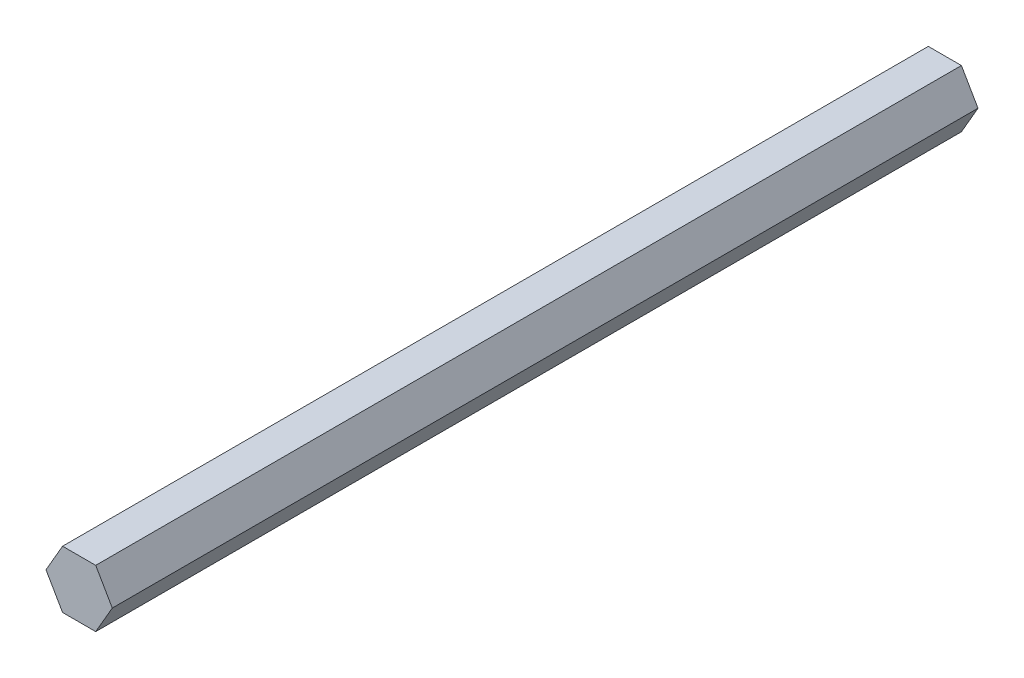
ISO-10303-21;
HEADER;
FILE_DESCRIPTION(('STEP AP214'),'2;1');
FILE_NAME('part.step','',(''),(''),'','','');
FILE_SCHEMA(('AUTOMOTIVE_DESIGN { 1 0 10303 214 1 1 1 1 }'));
ENDSEC;
DATA;
#1=APPLICATION_CONTEXT('core data for automotive mechanical design processes');
#2=APPLICATION_PROTOCOL_DEFINITION('international standard','automotive_design',2000,#1);
#3=PRODUCT_CONTEXT('',#1,'mechanical');
#4=PRODUCT('Part','Part','',(#3));
#5=PRODUCT_RELATED_PRODUCT_CATEGORY('part','',(#4));
#6=PRODUCT_DEFINITION_FORMATION('','',#4);
#7=PRODUCT_DEFINITION_CONTEXT('part definition',#1,'design');
#8=PRODUCT_DEFINITION('design','',#6,#7);
#9=PRODUCT_DEFINITION_SHAPE('','',#8);
#10=(LENGTH_UNIT() NAMED_UNIT(*) SI_UNIT(.MILLI.,.METRE.));
#11=(NAMED_UNIT(*) PLANE_ANGLE_UNIT() SI_UNIT($,.RADIAN.));
#12=(NAMED_UNIT(*) SI_UNIT($,.STERADIAN.) SOLID_ANGLE_UNIT());
#13=UNCERTAINTY_MEASURE_WITH_UNIT(LENGTH_MEASURE(1.E-05),#10,'distance_accuracy_value','');
#14=(GEOMETRIC_REPRESENTATION_CONTEXT(3) GLOBAL_UNCERTAINTY_ASSIGNED_CONTEXT((#13)) GLOBAL_UNIT_ASSIGNED_CONTEXT((#10,
#11,#12)) REPRESENTATION_CONTEXT('',''));
#15=CARTESIAN_POINT('',(0.,0.,0.));
#16=DIRECTION('',(0.,0.,1.));
#17=DIRECTION('',(1.,0.,0.));
#18=AXIS2_PLACEMENT_3D('',#15,#16,#17);
#19=CARTESIAN_POINT('',(7.33234841870825,0.,95.758));
#20=DIRECTION('',(-0.866025403784439,-0.5,0.));
#21=DIRECTION('',(0.5,-0.866025403784439,0.));
#22=AXIS2_PLACEMENT_3D('',#19,#20,#21);
#23=PLANE('',#22);
#24=DIRECTION('',(-0.5,0.866025403784439,0.));
#25=VECTOR('',#24,1.);
#26=CARTESIAN_POINT('',(7.33234841870825,0.,-95.758));
#27=LINE('',#26,#25);
#28=CARTESIAN_POINT('',(7.33234841870825,0.,-95.758));
#29=VERTEX_POINT('',#28);
#30=CARTESIAN_POINT('',(3.66617420935413,6.35,-95.758));
#31=VERTEX_POINT('',#30);
#32=EDGE_CURVE('E128',#29,#31,#27,.T.);
#33=ORIENTED_EDGE('',*,*,#32,.T.);
#34=DIRECTION('',(0.,0.,-1.));
#35=VECTOR('',#34,1.);
#36=CARTESIAN_POINT('',(3.66617420935413,6.35,95.758));
#37=LINE('',#36,#35);
#38=CARTESIAN_POINT('',(3.66617420935413,6.35,95.758));
#39=VERTEX_POINT('',#38);
#40=EDGE_CURVE('E11',#39,#31,#37,.T.);
#41=ORIENTED_EDGE('',*,*,#40,.F.);
#42=DIRECTION('',(-0.5,0.866025403784439,0.));
#43=VECTOR('',#42,1.);
#44=CARTESIAN_POINT('',(7.33234841870825,0.,95.758));
#45=LINE('',#44,#43);
#46=CARTESIAN_POINT('',(7.33234841870825,0.,95.758));
#47=VERTEX_POINT('',#46);
#48=EDGE_CURVE('E144',#47,#39,#45,.T.);
#49=ORIENTED_EDGE('',*,*,#48,.F.);
#50=DIRECTION('',(0.,0.,-1.));
#51=VECTOR('',#50,1.);
#52=CARTESIAN_POINT('',(7.33234841870825,0.,95.758));
#53=LINE('',#52,#51);
#54=EDGE_CURVE('E124',#47,#29,#53,.T.);
#55=ORIENTED_EDGE('',*,*,#54,.T.);
#56=EDGE_LOOP('',(#33,#41,#49,#55));
#57=FACE_BOUND('',#56,.T.);
#58=ADVANCED_FACE('F39',(#57),#23,.F.);
#59=CARTESIAN_POINT('',(3.66617420935413,6.35,95.758));
#60=DIRECTION('',(0.,-1.,0.));
#61=DIRECTION('',(1.,0.,0.));
#62=AXIS2_PLACEMENT_3D('',#59,#60,#61);
#63=PLANE('',#62);
#64=DIRECTION('',(-1.,0.,0.));
#65=VECTOR('',#64,1.);
#66=CARTESIAN_POINT('',(3.66617420935413,6.35,-95.758));
#67=LINE('',#66,#65);
#68=CARTESIAN_POINT('',(-3.66617420935412,6.35,-95.758));
#69=VERTEX_POINT('',#68);
#70=EDGE_CURVE('E132',#31,#69,#67,.T.);
#71=ORIENTED_EDGE('',*,*,#70,.T.);
#72=DIRECTION('',(0.,0.,-1.));
#73=VECTOR('',#72,1.);
#74=CARTESIAN_POINT('',(-3.66617420935412,6.35,95.758));
#75=LINE('',#74,#73);
#76=CARTESIAN_POINT('',(-3.66617420935412,6.35,95.758));
#77=VERTEX_POINT('',#76);
#78=EDGE_CURVE('E48',#77,#69,#75,.T.);
#79=ORIENTED_EDGE('',*,*,#78,.F.);
#80=DIRECTION('',(-1.,0.,0.));
#81=VECTOR('',#80,1.);
#82=CARTESIAN_POINT('',(3.66617420935413,6.35,95.758));
#83=LINE('',#82,#81);
#84=EDGE_CURVE('E93',#39,#77,#83,.T.);
#85=ORIENTED_EDGE('',*,*,#84,.F.);
#86=ORIENTED_EDGE('',*,*,#40,.T.);
#87=EDGE_LOOP('',(#71,#79,#85,#86));
#88=FACE_BOUND('',#87,.T.);
#89=ADVANCED_FACE('F172',(#88),#63,.F.);
#90=CARTESIAN_POINT('',(-3.66617420935412,6.35,95.758));
#91=DIRECTION('',(0.866025403784439,-0.5,0.));
#92=DIRECTION('',(0.5,0.866025403784439,0.));
#93=AXIS2_PLACEMENT_3D('',#90,#91,#92);
#94=PLANE('',#93);
#95=DIRECTION('',(-0.5,-0.866025403784439,0.));
#96=VECTOR('',#95,1.);
#97=CARTESIAN_POINT('',(-3.66617420935412,6.35,-95.758));
#98=LINE('',#97,#96);
#99=CARTESIAN_POINT('',(-7.33234841870824,0.,-95.758));
#100=VERTEX_POINT('',#99);
#101=EDGE_CURVE('E135',#69,#100,#98,.T.);
#102=ORIENTED_EDGE('',*,*,#101,.T.);
#103=DIRECTION('',(0.,0.,-1.));
#104=VECTOR('',#103,1.);
#105=CARTESIAN_POINT('',(-7.33234841870824,0.,95.758));
#106=LINE('',#105,#104);
#107=CARTESIAN_POINT('',(-7.33234841870824,0.,95.758));
#108=VERTEX_POINT('',#107);
#109=EDGE_CURVE('E117',#108,#100,#106,.T.);
#110=ORIENTED_EDGE('',*,*,#109,.F.);
#111=DIRECTION('',(-0.5,-0.866025403784439,0.));
#112=VECTOR('',#111,1.);
#113=CARTESIAN_POINT('',(-3.66617420935412,6.35,95.758));
#114=LINE('',#113,#112);
#115=EDGE_CURVE('E106',#77,#108,#114,.T.);
#116=ORIENTED_EDGE('',*,*,#115,.F.);
#117=ORIENTED_EDGE('',*,*,#78,.T.);
#118=EDGE_LOOP('',(#102,#110,#116,#117));
#119=FACE_BOUND('',#118,.T.);
#120=ADVANCED_FACE('F154',(#119),#94,.F.);
#121=CARTESIAN_POINT('',(-7.33234841870824,0.,95.758));
#122=DIRECTION('',(0.866025403784439,0.5,0.));
#123=DIRECTION('',(-0.5,0.866025403784439,0.));
#124=AXIS2_PLACEMENT_3D('',#121,#122,#123);
#125=PLANE('',#124);
#126=DIRECTION('',(0.5,-0.866025403784439,0.));
#127=VECTOR('',#126,1.);
#128=CARTESIAN_POINT('',(-7.33234841870824,0.,-95.758));
#129=LINE('',#128,#127);
#130=CARTESIAN_POINT('',(-3.66617420935412,-6.35,-95.758));
#131=VERTEX_POINT('',#130);
#132=EDGE_CURVE('E115',#100,#131,#129,.T.);
#133=ORIENTED_EDGE('',*,*,#132,.T.);
#134=DIRECTION('',(0.,0.,-1.));
#135=VECTOR('',#134,1.);
#136=CARTESIAN_POINT('',(-3.66617420935412,-6.35,95.758));
#137=LINE('',#136,#135);
#138=CARTESIAN_POINT('',(-3.66617420935412,-6.35,95.758));
#139=VERTEX_POINT('',#138);
#140=EDGE_CURVE('E112',#139,#131,#137,.T.);
#141=ORIENTED_EDGE('',*,*,#140,.F.);
#142=DIRECTION('',(0.5,-0.866025403784439,0.));
#143=VECTOR('',#142,1.);
#144=CARTESIAN_POINT('',(-7.33234841870824,0.,95.758));
#145=LINE('',#144,#143);
#146=EDGE_CURVE('E100',#108,#139,#145,.T.);
#147=ORIENTED_EDGE('',*,*,#146,.F.);
#148=ORIENTED_EDGE('',*,*,#109,.T.);
#149=EDGE_LOOP('',(#133,#141,#147,#148));
#150=FACE_BOUND('',#149,.T.);
#151=ADVANCED_FACE('F113',(#150),#125,.F.);
#152=CARTESIAN_POINT('',(-3.66617420935412,-6.35,95.758));
#153=DIRECTION('',(0.,1.,0.));
#154=DIRECTION('',(-1.,0.,0.));
#155=AXIS2_PLACEMENT_3D('',#152,#153,#154);
#156=PLANE('',#155);
#157=DIRECTION('',(1.,0.,0.));
#158=VECTOR('',#157,1.);
#159=CARTESIAN_POINT('',(-3.66617420935412,-6.35,-95.758));
#160=LINE('',#159,#158);
#161=CARTESIAN_POINT('',(3.66617420935412,-6.35,-95.758));
#162=VERTEX_POINT('',#161);
#163=EDGE_CURVE('E79',#131,#162,#160,.T.);
#164=ORIENTED_EDGE('',*,*,#163,.T.);
#165=DIRECTION('',(0.,0.,-1.));
#166=VECTOR('',#165,1.);
#167=CARTESIAN_POINT('',(3.66617420935412,-6.35,95.758));
#168=LINE('',#167,#166);
#169=CARTESIAN_POINT('',(3.66617420935412,-6.35,95.758));
#170=VERTEX_POINT('',#169);
#171=EDGE_CURVE('E118',#170,#162,#168,.T.);
#172=ORIENTED_EDGE('',*,*,#171,.F.);
#173=DIRECTION('',(1.,0.,0.));
#174=VECTOR('',#173,1.);
#175=CARTESIAN_POINT('',(-3.66617420935412,-6.35,95.758));
#176=LINE('',#175,#174);
#177=EDGE_CURVE('E104',#139,#170,#176,.T.);
#178=ORIENTED_EDGE('',*,*,#177,.F.);
#179=ORIENTED_EDGE('',*,*,#140,.T.);
#180=EDGE_LOOP('',(#164,#172,#178,#179));
#181=FACE_BOUND('',#180,.T.);
#182=ADVANCED_FACE('F120',(#181),#156,.F.);
#183=CARTESIAN_POINT('',(3.66617420935412,-6.35,95.758));
#184=DIRECTION('',(-0.866025403784439,0.5,0.));
#185=DIRECTION('',(-0.5,-0.866025403784439,0.));
#186=AXIS2_PLACEMENT_3D('',#183,#184,#185);
#187=PLANE('',#186);
#188=DIRECTION('',(0.5,0.866025403784439,0.));
#189=VECTOR('',#188,1.);
#190=CARTESIAN_POINT('',(3.66617420935412,-6.35,-95.758));
#191=LINE('',#190,#189);
#192=EDGE_CURVE('E85',#162,#29,#191,.T.);
#193=ORIENTED_EDGE('',*,*,#192,.T.);
#194=ORIENTED_EDGE('',*,*,#54,.F.);
#195=DIRECTION('',(0.5,0.866025403784439,0.));
#196=VECTOR('',#195,1.);
#197=CARTESIAN_POINT('',(3.66617420935412,-6.35,95.758));
#198=LINE('',#197,#196);
#199=EDGE_CURVE('E56',#170,#47,#198,.T.);
#200=ORIENTED_EDGE('',*,*,#199,.F.);
#201=ORIENTED_EDGE('',*,*,#171,.T.);
#202=EDGE_LOOP('',(#193,#194,#200,#201));
#203=FACE_BOUND('',#202,.T.);
#204=ADVANCED_FACE('F161',(#203),#187,.F.);
#205=CARTESIAN_POINT('',(0.,0.,95.758));
#206=DIRECTION('',(0.,0.,1.));
#207=DIRECTION('',(1.,0.,0.));
#208=AXIS2_PLACEMENT_3D('',#205,#206,#207);
#209=PLANE('',#208);
#210=ORIENTED_EDGE('',*,*,#48,.T.);
#211=ORIENTED_EDGE('',*,*,#84,.T.);
#212=ORIENTED_EDGE('',*,*,#115,.T.);
#213=ORIENTED_EDGE('',*,*,#146,.T.);
#214=ORIENTED_EDGE('',*,*,#177,.T.);
#215=ORIENTED_EDGE('',*,*,#199,.T.);
#216=EDGE_LOOP('',(#210,#211,#212,#213,#214,#215));
#217=FACE_BOUND('',#216,.T.);
#218=ADVANCED_FACE('F102',(#217),#209,.T.);
#219=CARTESIAN_POINT('',(0.,0.,-95.758));
#220=DIRECTION('',(0.,0.,1.));
#221=DIRECTION('',(1.,0.,0.));
#222=AXIS2_PLACEMENT_3D('',#219,#220,#221);
#223=PLANE('',#222);
#224=ORIENTED_EDGE('',*,*,#32,.F.);
#225=ORIENTED_EDGE('',*,*,#192,.F.);
#226=ORIENTED_EDGE('',*,*,#163,.F.);
#227=ORIENTED_EDGE('',*,*,#132,.F.);
#228=ORIENTED_EDGE('',*,*,#101,.F.);
#229=ORIENTED_EDGE('',*,*,#70,.F.);
#230=EDGE_LOOP('',(#224,#225,#226,#227,#228,#229));
#231=FACE_BOUND('',#230,.T.);
#232=ADVANCED_FACE('F157',(#231),#223,.F.);
#233=CLOSED_SHELL('',(#58,#89,#120,#151,#182,#204,#218,#232));
#234=MANIFOLD_SOLID_BREP('B2',#233);
#235=ADVANCED_BREP_SHAPE_REPRESENTATION('',(#18,#234),#14);
#236=SHAPE_DEFINITION_REPRESENTATION(#9,#235);
ENDSEC;
END-ISO-10303-21;
